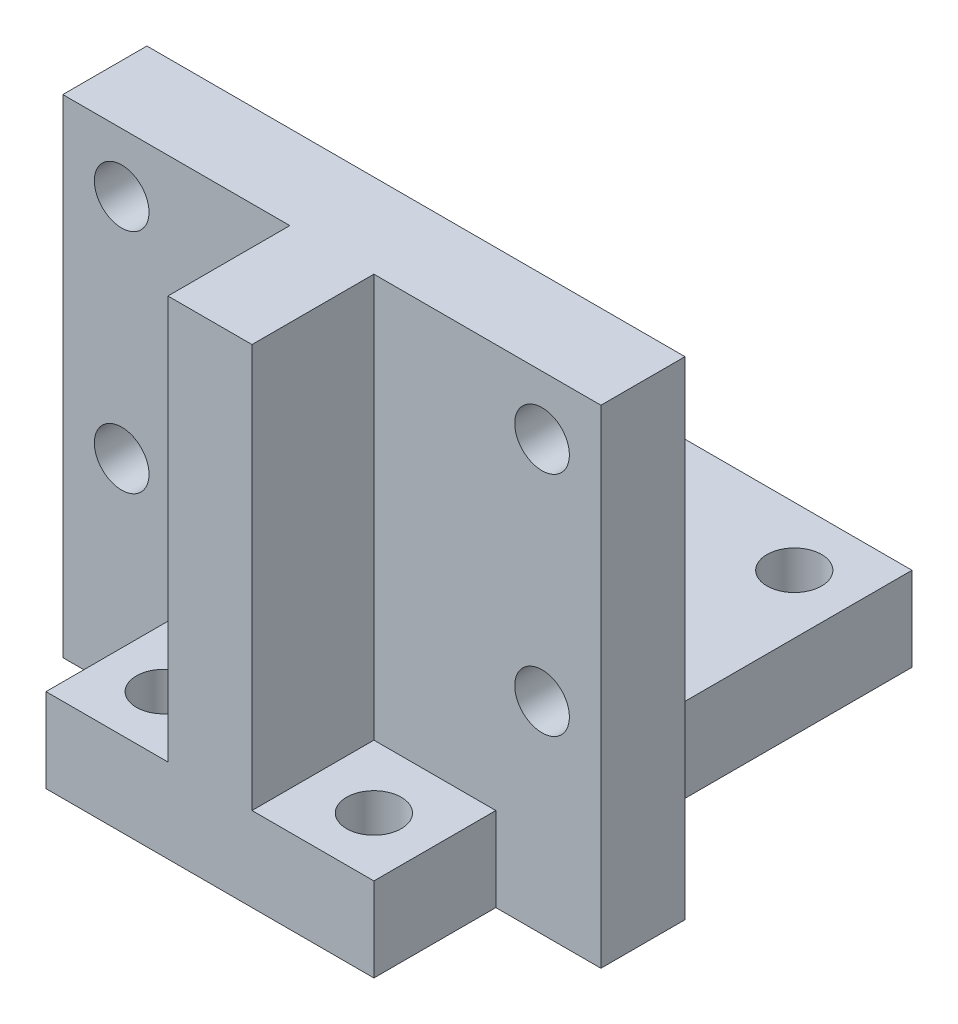
ISO-10303-21;
HEADER;
FILE_DESCRIPTION(('STEP AP214'),'2;1');
FILE_NAME('part.step','',(''),(''),'','','');
FILE_SCHEMA(('AUTOMOTIVE_DESIGN { 1 0 10303 214 1 1 1 1 }'));
ENDSEC;
DATA;
#1=APPLICATION_CONTEXT('core data for automotive mechanical design processes');
#2=APPLICATION_PROTOCOL_DEFINITION('international standard','automotive_design',2000,#1);
#3=PRODUCT_CONTEXT('',#1,'mechanical');
#4=PRODUCT('Part','Part','',(#3));
#5=PRODUCT_RELATED_PRODUCT_CATEGORY('part','',(#4));
#6=PRODUCT_DEFINITION_FORMATION('','',#4);
#7=PRODUCT_DEFINITION_CONTEXT('part definition',#1,'design');
#8=PRODUCT_DEFINITION('design','',#6,#7);
#9=PRODUCT_DEFINITION_SHAPE('','',#8);
#10=(LENGTH_UNIT() NAMED_UNIT(*) SI_UNIT(.MILLI.,.METRE.));
#11=(NAMED_UNIT(*) PLANE_ANGLE_UNIT() SI_UNIT($,.RADIAN.));
#12=(NAMED_UNIT(*) SI_UNIT($,.STERADIAN.) SOLID_ANGLE_UNIT());
#13=UNCERTAINTY_MEASURE_WITH_UNIT(LENGTH_MEASURE(1.E-05),#10,'distance_accuracy_value','');
#14=(GEOMETRIC_REPRESENTATION_CONTEXT(3) GLOBAL_UNCERTAINTY_ASSIGNED_CONTEXT((#13)) GLOBAL_UNIT_ASSIGNED_CONTEXT((#10,
#11,#12)) REPRESENTATION_CONTEXT('',''));
#15=CARTESIAN_POINT('',(0.,0.,0.));
#16=DIRECTION('',(0.,0.,1.));
#17=DIRECTION('',(1.,0.,0.));
#18=AXIS2_PLACEMENT_3D('',#15,#16,#17);
#19=CARTESIAN_POINT('',(0.,10.,0.));
#20=DIRECTION('',(0.,-1.,0.));
#21=DIRECTION('',(0.,0.,-1.));
#22=AXIS2_PLACEMENT_3D('',#19,#20,#21);
#23=PLANE('',#22);
#24=CARTESIAN_POINT('',(32.,10.,-7.));
#25=DIRECTION('',(0.,1.,0.));
#26=DIRECTION('',(0.,0.,1.));
#27=AXIS2_PLACEMENT_3D('',#24,#25,#26);
#28=CIRCLE('',#27,3.25);
#29=CARTESIAN_POINT('',(32.,10.,-3.75));
#30=VERTEX_POINT('',#29);
#31=EDGE_CURVE('E295',#30,#30,#28,.T.);
#32=ORIENTED_EDGE('',*,*,#31,.F.);
#33=EDGE_LOOP('',(#32));
#34=FACE_BOUND('',#33,.T.);
#35=DIRECTION('',(1.,0.,0.));
#36=VECTOR('',#35,1.);
#37=CARTESIAN_POINT('',(0.,10.,-14.5));
#38=LINE('',#37,#36);
#39=CARTESIAN_POINT('',(24.5,10.,-14.5));
#40=VERTEX_POINT('',#39);
#41=CARTESIAN_POINT('',(39.,10.,-14.5));
#42=VERTEX_POINT('',#41);
#43=EDGE_CURVE('E281',#40,#42,#38,.T.);
#44=ORIENTED_EDGE('',*,*,#43,.F.);
#45=DIRECTION('',(0.,0.,1.));
#46=VECTOR('',#45,1.);
#47=CARTESIAN_POINT('',(24.5,10.,-39.002));
#48=LINE('',#47,#46);
#49=CARTESIAN_POINT('',(24.5,10.,0.));
#50=VERTEX_POINT('',#49);
#51=EDGE_CURVE('E56',#40,#50,#48,.T.);
#52=ORIENTED_EDGE('',*,*,#51,.T.);
#53=DIRECTION('',(1.,0.,0.));
#54=VECTOR('',#53,1.);
#55=CARTESIAN_POINT('',(0.,10.,0.));
#56=LINE('',#55,#54);
#57=CARTESIAN_POINT('',(39.,10.,0.));
#58=VERTEX_POINT('',#57);
#59=EDGE_CURVE('E164',#50,#58,#56,.T.);
#60=ORIENTED_EDGE('',*,*,#59,.T.);
#61=DIRECTION('',(0.,0.,-1.));
#62=VECTOR('',#61,1.);
#63=CARTESIAN_POINT('',(39.,10.,0.));
#64=LINE('',#63,#62);
#65=EDGE_CURVE('E314',#58,#42,#64,.T.);
#66=ORIENTED_EDGE('',*,*,#65,.T.);
#67=EDGE_LOOP('',(#44,#52,#60,#66));
#68=FACE_BOUND('',#67,.T.);
#69=ADVANCED_FACE('F41',(#34,#68),#23,.F.);
#70=CARTESIAN_POINT('',(0.,0.,-14.5));
#71=DIRECTION('',(0.,0.,-1.));
#72=DIRECTION('',(-1.,0.,0.));
#73=AXIS2_PLACEMENT_3D('',#70,#71,#72);
#74=PLANE('',#73);
#75=CARTESIAN_POINT('',(44.5,24.,-14.5));
#76=DIRECTION('',(0.,0.,1.));
#77=DIRECTION('',(1.,0.,0.));
#78=AXIS2_PLACEMENT_3D('',#75,#76,#77);
#79=CIRCLE('',#78,3.25);
#80=CARTESIAN_POINT('',(47.75,24.,-14.5));
#81=VERTEX_POINT('',#80);
#82=EDGE_CURVE('E220',#81,#81,#79,.T.);
#83=ORIENTED_EDGE('',*,*,#82,.F.);
#84=EDGE_LOOP('',(#83));
#85=FACE_BOUND('',#84,.T.);
#86=CARTESIAN_POINT('',(44.5,51.,-14.5));
#87=DIRECTION('',(0.,0.,1.));
#88=DIRECTION('',(1.,0.,0.));
#89=AXIS2_PLACEMENT_3D('',#86,#87,#88);
#90=CIRCLE('',#89,3.25);
#91=CARTESIAN_POINT('',(47.75,51.,-14.5));
#92=VERTEX_POINT('',#91);
#93=EDGE_CURVE('E232',#92,#92,#90,.T.);
#94=ORIENTED_EDGE('',*,*,#93,.F.);
#95=EDGE_LOOP('',(#94));
#96=FACE_BOUND('',#95,.T.);
#97=DIRECTION('',(-1.,0.,0.));
#98=VECTOR('',#97,1.);
#99=CARTESIAN_POINT('',(-12.5,58.,-14.5));
#100=LINE('',#99,#98);
#101=CARTESIAN_POINT('',(51.5,58.,-14.5));
#102=VERTEX_POINT('',#101);
#103=CARTESIAN_POINT('',(24.5,58.,-14.5));
#104=VERTEX_POINT('',#103);
#105=EDGE_CURVE('E255',#102,#104,#100,.T.);
#106=ORIENTED_EDGE('',*,*,#105,.T.);
#107=DIRECTION('',(0.,1.,0.));
#108=VECTOR('',#107,1.);
#109=CARTESIAN_POINT('',(24.5,10.,-14.5));
#110=LINE('',#109,#108);
#111=EDGE_CURVE('E213',#40,#104,#110,.T.);
#112=ORIENTED_EDGE('',*,*,#111,.F.);
#113=ORIENTED_EDGE('',*,*,#43,.T.);
#114=DIRECTION('',(0.,-1.,0.));
#115=VECTOR('',#114,1.);
#116=CARTESIAN_POINT('',(39.,10.,-14.5));
#117=LINE('',#116,#115);
#118=CARTESIAN_POINT('',(39.,0.,-14.5));
#119=VERTEX_POINT('',#118);
#120=EDGE_CURVE('E11',#42,#119,#117,.T.);
#121=ORIENTED_EDGE('',*,*,#120,.T.);
#122=DIRECTION('',(1.,0.,0.));
#123=VECTOR('',#122,1.);
#124=CARTESIAN_POINT('',(-12.5,0.,-14.5));
#125=LINE('',#124,#123);
#126=CARTESIAN_POINT('',(51.5,0.,-14.5));
#127=VERTEX_POINT('',#126);
#128=EDGE_CURVE('E247',#119,#127,#125,.T.);
#129=ORIENTED_EDGE('',*,*,#128,.T.);
#130=DIRECTION('',(0.,1.,0.));
#131=VECTOR('',#130,1.);
#132=CARTESIAN_POINT('',(51.5,0.,-14.5));
#133=LINE('',#132,#131);
#134=EDGE_CURVE('E252',#127,#102,#133,.T.);
#135=ORIENTED_EDGE('',*,*,#134,.T.);
#136=EDGE_LOOP('',(#106,#112,#113,#121,#129,#135));
#137=FACE_BOUND('',#136,.T.);
#138=ADVANCED_FACE('F349',(#85,#96,#137),#74,.F.);
#139=CARTESIAN_POINT('',(7.,10.,-7.));
#140=DIRECTION('',(0.,1.,0.));
#141=DIRECTION('',(0.,0.,1.));
#142=AXIS2_PLACEMENT_3D('',#139,#140,#141);
#143=CIRCLE('',#142,3.25);
#144=CARTESIAN_POINT('',(7.,10.,-3.75));
#145=VERTEX_POINT('',#144);
#146=EDGE_CURVE('E289',#145,#145,#143,.T.);
#147=ORIENTED_EDGE('',*,*,#146,.F.);
#148=EDGE_LOOP('',(#147));
#149=FACE_BOUND('',#148,.T.);
#150=CARTESIAN_POINT('',(0.,10.,0.));
#151=VERTEX_POINT('',#150);
#152=CARTESIAN_POINT('',(14.5,10.,0.));
#153=VERTEX_POINT('',#152);
#154=EDGE_CURVE('E64',#151,#153,#56,.T.);
#155=ORIENTED_EDGE('',*,*,#154,.T.);
#156=DIRECTION('',(0.,0.,1.));
#157=VECTOR('',#156,1.);
#158=CARTESIAN_POINT('',(14.5,10.,-39.002));
#159=LINE('',#158,#157);
#160=CARTESIAN_POINT('',(14.5,10.,-14.5));
#161=VERTEX_POINT('',#160);
#162=EDGE_CURVE('E211',#161,#153,#159,.T.);
#163=ORIENTED_EDGE('',*,*,#162,.F.);
#164=CARTESIAN_POINT('',(0.,10.,-14.5));
#165=VERTEX_POINT('',#164);
#166=EDGE_CURVE('E282',#165,#161,#38,.T.);
#167=ORIENTED_EDGE('',*,*,#166,.F.);
#168=DIRECTION('',(0.,0.,1.));
#169=VECTOR('',#168,1.);
#170=CARTESIAN_POINT('',(0.,10.,0.));
#171=LINE('',#170,#169);
#172=EDGE_CURVE('E165',#165,#151,#171,.T.);
#173=ORIENTED_EDGE('',*,*,#172,.T.);
#174=EDGE_LOOP('',(#155,#163,#167,#173));
#175=FACE_BOUND('',#174,.T.);
#176=ADVANCED_FACE('F383',(#149,#175),#23,.F.);
#177=CARTESIAN_POINT('',(0.,10.,0.));
#178=DIRECTION('',(1.,0.,0.));
#179=DIRECTION('',(0.,0.,-1.));
#180=AXIS2_PLACEMENT_3D('',#177,#178,#179);
#181=PLANE('',#180);
#182=DIRECTION('',(0.,1.,0.));
#183=VECTOR('',#182,1.);
#184=CARTESIAN_POINT('',(0.,10.,-14.5));
#185=LINE('',#184,#183);
#186=CARTESIAN_POINT('',(0.,0.,-14.5));
#187=VERTEX_POINT('',#186);
#188=EDGE_CURVE('E285',#187,#165,#185,.T.);
#189=ORIENTED_EDGE('',*,*,#188,.F.);
#190=DIRECTION('',(0.,0.,1.));
#191=VECTOR('',#190,1.);
#192=CARTESIAN_POINT('',(0.,0.,0.));
#193=LINE('',#192,#191);
#194=CARTESIAN_POINT('',(0.,0.,0.));
#195=VERTEX_POINT('',#194);
#196=EDGE_CURVE('E310',#187,#195,#193,.T.);
#197=ORIENTED_EDGE('',*,*,#196,.T.);
#198=DIRECTION('',(0.,-1.,0.));
#199=VECTOR('',#198,1.);
#200=CARTESIAN_POINT('',(0.,10.,0.));
#201=LINE('',#200,#199);
#202=EDGE_CURVE('E327',#151,#195,#201,.T.);
#203=ORIENTED_EDGE('',*,*,#202,.F.);
#204=ORIENTED_EDGE('',*,*,#172,.F.);
#205=EDGE_LOOP('',(#189,#197,#203,#204));
#206=FACE_BOUND('',#205,.T.);
#207=ADVANCED_FACE('F364',(#206),#181,.F.);
#208=CARTESIAN_POINT('',(39.,10.,0.));
#209=DIRECTION('',(-1.,0.,0.));
#210=DIRECTION('',(0.,0.,1.));
#211=AXIS2_PLACEMENT_3D('',#208,#209,#210);
#212=PLANE('',#211);
#213=ORIENTED_EDGE('',*,*,#120,.F.);
#214=ORIENTED_EDGE('',*,*,#65,.F.);
#215=DIRECTION('',(0.,-1.,0.));
#216=VECTOR('',#215,1.);
#217=CARTESIAN_POINT('',(39.,10.,0.));
#218=LINE('',#217,#216);
#219=CARTESIAN_POINT('',(39.,0.,0.));
#220=VERTEX_POINT('',#219);
#221=EDGE_CURVE('E317',#58,#220,#218,.T.);
#222=ORIENTED_EDGE('',*,*,#221,.T.);
#223=DIRECTION('',(0.,0.,-1.));
#224=VECTOR('',#223,1.);
#225=CARTESIAN_POINT('',(39.,0.,0.));
#226=LINE('',#225,#224);
#227=EDGE_CURVE('E323',#220,#119,#226,.T.);
#228=ORIENTED_EDGE('',*,*,#227,.T.);
#229=EDGE_LOOP('',(#213,#214,#222,#228));
#230=FACE_BOUND('',#229,.T.);
#231=ADVANCED_FACE('F355',(#230),#212,.F.);
#232=CARTESIAN_POINT('',(0.,10.,-64.));
#233=VERTEX_POINT('',#232);
#234=CARTESIAN_POINT('',(0.,10.,-24.5));
#235=VERTEX_POINT('',#234);
#236=EDGE_CURVE('E155',#233,#235,#171,.T.);
#237=ORIENTED_EDGE('',*,*,#236,.T.);
#238=DIRECTION('',(1.,0.,0.));
#239=VECTOR('',#238,1.);
#240=CARTESIAN_POINT('',(0.,10.,-24.5));
#241=LINE('',#240,#239);
#242=CARTESIAN_POINT('',(39.,10.,-24.5));
#243=VERTEX_POINT('',#242);
#244=EDGE_CURVE('E278',#235,#243,#241,.T.);
#245=ORIENTED_EDGE('',*,*,#244,.T.);
#246=CARTESIAN_POINT('',(39.,10.,-64.));
#247=VERTEX_POINT('',#246);
#248=EDGE_CURVE('E179',#243,#247,#64,.T.);
#249=ORIENTED_EDGE('',*,*,#248,.T.);
#250=DIRECTION('',(-1.,0.,0.));
#251=VECTOR('',#250,1.);
#252=CARTESIAN_POINT('',(0.,10.,-64.));
#253=LINE('',#252,#251);
#254=EDGE_CURVE('E171',#247,#233,#253,.T.);
#255=ORIENTED_EDGE('',*,*,#254,.T.);
#256=EDGE_LOOP('',(#237,#245,#249,#255));
#257=FACE_BOUND('',#256,.T.);
#258=CARTESIAN_POINT('',(7.,10.,-32.));
#259=DIRECTION('',(0.,1.,0.));
#260=DIRECTION('',(0.,0.,1.));
#261=AXIS2_PLACEMENT_3D('',#258,#259,#260);
#262=CIRCLE('',#261,3.25);
#263=CARTESIAN_POINT('',(7.,10.,-28.75));
#264=VERTEX_POINT('',#263);
#265=EDGE_CURVE('E307',#264,#264,#262,.T.);
#266=ORIENTED_EDGE('',*,*,#265,.F.);
#267=EDGE_LOOP('',(#266));
#268=FACE_BOUND('',#267,.T.);
#269=CARTESIAN_POINT('',(32.,10.,-32.));
#270=DIRECTION('',(0.,1.,0.));
#271=DIRECTION('',(0.,0.,1.));
#272=AXIS2_PLACEMENT_3D('',#269,#270,#271);
#273=CIRCLE('',#272,3.25);
#274=CARTESIAN_POINT('',(32.,10.,-28.75));
#275=VERTEX_POINT('',#274);
#276=EDGE_CURVE('E301',#275,#275,#273,.T.);
#277=ORIENTED_EDGE('',*,*,#276,.F.);
#278=EDGE_LOOP('',(#277));
#279=FACE_BOUND('',#278,.T.);
#280=CARTESIAN_POINT('',(32.,10.,-57.));
#281=DIRECTION('',(0.,1.,0.));
#282=DIRECTION('',(0.,0.,1.));
#283=AXIS2_PLACEMENT_3D('',#280,#281,#282);
#284=CIRCLE('',#283,3.25);
#285=CARTESIAN_POINT('',(32.,9.99999999999999,-53.75));
#286=VERTEX_POINT('',#285);
#287=EDGE_CURVE('E182',#286,#286,#284,.T.);
#288=ORIENTED_EDGE('',*,*,#287,.F.);
#289=EDGE_LOOP('',(#288));
#290=FACE_BOUND('',#289,.T.);
#291=CARTESIAN_POINT('',(7.,10.,-57.));
#292=DIRECTION('',(0.,1.,0.));
#293=DIRECTION('',(0.,0.,1.));
#294=AXIS2_PLACEMENT_3D('',#291,#292,#293);
#295=CIRCLE('',#294,3.25);
#296=CARTESIAN_POINT('',(7.,9.99999999999999,-53.75));
#297=VERTEX_POINT('',#296);
#298=EDGE_CURVE('E188',#297,#297,#295,.T.);
#299=ORIENTED_EDGE('',*,*,#298,.F.);
#300=EDGE_LOOP('',(#299));
#301=FACE_BOUND('',#300,.T.);
#302=ADVANCED_FACE('F176',(#257,#268,#279,#290,#301),#23,.F.);
#303=CARTESIAN_POINT('',(0.,0.,0.));
#304=DIRECTION('',(0.,-1.,0.));
#305=DIRECTION('',(0.,0.,-1.));
#306=AXIS2_PLACEMENT_3D('',#303,#304,#305);
#307=PLANE('',#306);
#308=CARTESIAN_POINT('',(39.,0.,-24.5));
#309=VERTEX_POINT('',#308);
#310=CARTESIAN_POINT('',(39.,0.,-64.));
#311=VERTEX_POINT('',#310);
#312=EDGE_CURVE('E322',#309,#311,#226,.T.);
#313=ORIENTED_EDGE('',*,*,#312,.F.);
#314=DIRECTION('',(1.,0.,0.));
#315=VECTOR('',#314,1.);
#316=CARTESIAN_POINT('',(-12.5,0.,-24.5));
#317=LINE('',#316,#315);
#318=CARTESIAN_POINT('',(51.5,0.,-24.5));
#319=VERTEX_POINT('',#318);
#320=EDGE_CURVE('E260',#309,#319,#317,.T.);
#321=ORIENTED_EDGE('',*,*,#320,.T.);
#322=DIRECTION('',(0.,0.,-1.));
#323=VECTOR('',#322,1.);
#324=CARTESIAN_POINT('',(51.5,0.,-14.5));
#325=LINE('',#324,#323);
#326=EDGE_CURVE('E272',#127,#319,#325,.T.);
#327=ORIENTED_EDGE('',*,*,#326,.F.);
#328=ORIENTED_EDGE('',*,*,#128,.F.);
#329=ORIENTED_EDGE('',*,*,#227,.F.);
#330=DIRECTION('',(1.,0.,0.));
#331=VECTOR('',#330,1.);
#332=CARTESIAN_POINT('',(0.,0.,0.));
#333=LINE('',#332,#331);
#334=EDGE_CURVE('E320',#195,#220,#333,.T.);
#335=ORIENTED_EDGE('',*,*,#334,.F.);
#336=ORIENTED_EDGE('',*,*,#196,.F.);
#337=CARTESIAN_POINT('',(-12.5,0.,-14.5));
#338=VERTEX_POINT('',#337);
#339=EDGE_CURVE('E249',#338,#187,#125,.T.);
#340=ORIENTED_EDGE('',*,*,#339,.F.);
#341=DIRECTION('',(0.,0.,-1.));
#342=VECTOR('',#341,1.);
#343=CARTESIAN_POINT('',(-12.5,0.,-14.5));
#344=LINE('',#343,#342);
#345=CARTESIAN_POINT('',(-12.5,0.,-24.5));
#346=VERTEX_POINT('',#345);
#347=EDGE_CURVE('E275',#338,#346,#344,.T.);
#348=ORIENTED_EDGE('',*,*,#347,.T.);
#349=CARTESIAN_POINT('',(0.,0.,-24.5));
#350=VERTEX_POINT('',#349);
#351=EDGE_CURVE('E261',#346,#350,#317,.T.);
#352=ORIENTED_EDGE('',*,*,#351,.T.);
#353=CARTESIAN_POINT('',(0.,0.,-64.));
#354=VERTEX_POINT('',#353);
#355=EDGE_CURVE('E318',#354,#350,#193,.T.);
#356=ORIENTED_EDGE('',*,*,#355,.F.);
#357=DIRECTION('',(-1.,0.,0.));
#358=VECTOR('',#357,1.);
#359=CARTESIAN_POINT('',(0.,0.,-64.));
#360=LINE('',#359,#358);
#361=EDGE_CURVE('E173',#311,#354,#360,.T.);
#362=ORIENTED_EDGE('',*,*,#361,.F.);
#363=EDGE_LOOP('',(#313,#321,#327,#328,#329,#335,#336,#340,#348,#352,#356,#362));
#364=FACE_BOUND('',#363,.T.);
#365=CARTESIAN_POINT('',(7.,0.,-32.));
#366=DIRECTION('',(0.,1.,0.));
#367=DIRECTION('',(0.,0.,1.));
#368=AXIS2_PLACEMENT_3D('',#365,#366,#367);
#369=CIRCLE('',#368,3.25);
#370=CARTESIAN_POINT('',(7.,0.,-28.75));
#371=VERTEX_POINT('',#370);
#372=EDGE_CURVE('E304',#371,#371,#369,.T.);
#373=ORIENTED_EDGE('',*,*,#372,.T.);
#374=EDGE_LOOP('',(#373));
#375=FACE_BOUND('',#374,.T.);
#376=CARTESIAN_POINT('',(32.,0.,-32.));
#377=DIRECTION('',(0.,1.,0.));
#378=DIRECTION('',(0.,0.,1.));
#379=AXIS2_PLACEMENT_3D('',#376,#377,#378);
#380=CIRCLE('',#379,3.25);
#381=CARTESIAN_POINT('',(32.,0.,-28.75));
#382=VERTEX_POINT('',#381);
#383=EDGE_CURVE('E298',#382,#382,#380,.T.);
#384=ORIENTED_EDGE('',*,*,#383,.T.);
#385=EDGE_LOOP('',(#384));
#386=FACE_BOUND('',#385,.T.);
#387=CARTESIAN_POINT('',(7.,0.,-7.));
#388=DIRECTION('',(0.,1.,0.));
#389=DIRECTION('',(0.,0.,1.));
#390=AXIS2_PLACEMENT_3D('',#387,#388,#389);
#391=CIRCLE('',#390,3.25);
#392=CARTESIAN_POINT('',(7.,0.,-3.75));
#393=VERTEX_POINT('',#392);
#394=EDGE_CURVE('E288',#393,#393,#391,.T.);
#395=ORIENTED_EDGE('',*,*,#394,.T.);
#396=EDGE_LOOP('',(#395));
#397=FACE_BOUND('',#396,.T.);
#398=CARTESIAN_POINT('',(32.,0.,-7.));
#399=DIRECTION('',(0.,1.,0.));
#400=DIRECTION('',(0.,0.,1.));
#401=AXIS2_PLACEMENT_3D('',#398,#399,#400);
#402=CIRCLE('',#401,3.25);
#403=CARTESIAN_POINT('',(32.,0.,-3.75));
#404=VERTEX_POINT('',#403);
#405=EDGE_CURVE('E292',#404,#404,#402,.T.);
#406=ORIENTED_EDGE('',*,*,#405,.T.);
#407=EDGE_LOOP('',(#406));
#408=FACE_BOUND('',#407,.T.);
#409=CARTESIAN_POINT('',(32.,0.,-57.));
#410=DIRECTION('',(0.,-1.,0.));
#411=DIRECTION('',(0.,0.,-1.));
#412=AXIS2_PLACEMENT_3D('',#409,#410,#411);
#413=CIRCLE('',#412,3.25);
#414=CARTESIAN_POINT('',(32.,0.,-53.75));
#415=VERTEX_POINT('',#414);
#416=EDGE_CURVE('E181',#415,#415,#413,.F.);
#417=ORIENTED_EDGE('',*,*,#416,.T.);
#418=EDGE_LOOP('',(#417));
#419=FACE_BOUND('',#418,.T.);
#420=CARTESIAN_POINT('',(7.,0.,-57.));
#421=DIRECTION('',(0.,-1.,0.));
#422=DIRECTION('',(0.,0.,-1.));
#423=AXIS2_PLACEMENT_3D('',#420,#421,#422);
#424=CIRCLE('',#423,3.25);
#425=CARTESIAN_POINT('',(7.,0.,-53.75));
#426=VERTEX_POINT('',#425);
#427=EDGE_CURVE('E185',#426,#426,#424,.F.);
#428=ORIENTED_EDGE('',*,*,#427,.T.);
#429=EDGE_LOOP('',(#428));
#430=FACE_BOUND('',#429,.T.);
#431=ADVANCED_FACE('F340',(#364,#375,#386,#397,#408,#419,#430),#307,.T.);
#432=ORIENTED_EDGE('',*,*,#355,.T.);
#433=DIRECTION('',(0.,1.,0.));
#434=VECTOR('',#433,1.);
#435=CARTESIAN_POINT('',(0.,10.,-24.5));
#436=LINE('',#435,#434);
#437=EDGE_CURVE('E160',#350,#235,#436,.T.);
#438=ORIENTED_EDGE('',*,*,#437,.T.);
#439=ORIENTED_EDGE('',*,*,#236,.F.);
#440=DIRECTION('',(0.,1.,0.));
#441=VECTOR('',#440,1.);
#442=CARTESIAN_POINT('',(0.,-46.3249392876019,-64.));
#443=LINE('',#442,#441);
#444=EDGE_CURVE('E157',#354,#233,#443,.T.);
#445=ORIENTED_EDGE('',*,*,#444,.F.);
#446=EDGE_LOOP('',(#432,#438,#439,#445));
#447=FACE_BOUND('',#446,.T.);
#448=ADVANCED_FACE('F43',(#447),#181,.F.);
#449=CARTESIAN_POINT('',(0.,10.,0.));
#450=DIRECTION('',(0.,0.,-1.));
#451=DIRECTION('',(-1.,0.,0.));
#452=AXIS2_PLACEMENT_3D('',#449,#450,#451);
#453=PLANE('',#452);
#454=ORIENTED_EDGE('',*,*,#334,.T.);
#455=ORIENTED_EDGE('',*,*,#221,.F.);
#456=ORIENTED_EDGE('',*,*,#59,.F.);
#457=DIRECTION('',(0.,1.,0.));
#458=VECTOR('',#457,1.);
#459=CARTESIAN_POINT('',(24.5,10.,0.));
#460=LINE('',#459,#458);
#461=CARTESIAN_POINT('',(24.5,58.,0.));
#462=VERTEX_POINT('',#461);
#463=EDGE_CURVE('E198',#50,#462,#460,.T.);
#464=ORIENTED_EDGE('',*,*,#463,.T.);
#465=DIRECTION('',(-1.,0.,0.));
#466=VECTOR('',#465,1.);
#467=CARTESIAN_POINT('',(14.5,58.,0.));
#468=LINE('',#467,#466);
#469=CARTESIAN_POINT('',(14.5,58.,0.));
#470=VERTEX_POINT('',#469);
#471=EDGE_CURVE('E202',#462,#470,#468,.T.);
#472=ORIENTED_EDGE('',*,*,#471,.T.);
#473=DIRECTION('',(0.,-1.,0.));
#474=VECTOR('',#473,1.);
#475=CARTESIAN_POINT('',(14.5,10.,0.));
#476=LINE('',#475,#474);
#477=EDGE_CURVE('E194',#470,#153,#476,.T.);
#478=ORIENTED_EDGE('',*,*,#477,.T.);
#479=ORIENTED_EDGE('',*,*,#154,.F.);
#480=ORIENTED_EDGE('',*,*,#202,.T.);
#481=EDGE_LOOP('',(#454,#455,#456,#464,#472,#478,#479,#480));
#482=FACE_BOUND('',#481,.T.);
#483=ADVANCED_FACE('F359',(#482),#453,.F.);
#484=ORIENTED_EDGE('',*,*,#248,.F.);
#485=DIRECTION('',(0.,-1.,0.));
#486=VECTOR('',#485,1.);
#487=CARTESIAN_POINT('',(39.,10.,-24.5));
#488=LINE('',#487,#486);
#489=EDGE_CURVE('E49',#243,#309,#488,.T.);
#490=ORIENTED_EDGE('',*,*,#489,.T.);
#491=ORIENTED_EDGE('',*,*,#312,.T.);
#492=DIRECTION('',(0.,1.,0.));
#493=VECTOR('',#492,1.);
#494=CARTESIAN_POINT('',(39.,-46.3249392876019,-64.));
#495=LINE('',#494,#493);
#496=EDGE_CURVE('E174',#311,#247,#495,.T.);
#497=ORIENTED_EDGE('',*,*,#496,.T.);
#498=EDGE_LOOP('',(#484,#490,#491,#497));
#499=FACE_BOUND('',#498,.T.);
#500=ADVANCED_FACE('F333',(#499),#212,.F.);
#501=CARTESIAN_POINT('',(7.,10.,-32.));
#502=DIRECTION('',(0.,-1.,0.));
#503=DIRECTION('',(0.,0.,-1.));
#504=AXIS2_PLACEMENT_3D('',#501,#502,#503);
#505=CYLINDRICAL_SURFACE('',#504,3.25);
#506=ORIENTED_EDGE('',*,*,#265,.T.);
#507=EDGE_LOOP('',(#506));
#508=FACE_BOUND('',#507,.T.);
#509=ORIENTED_EDGE('',*,*,#372,.F.);
#510=EDGE_LOOP('',(#509));
#511=FACE_BOUND('',#510,.T.);
#512=ADVANCED_FACE('F407',(#508,#511),#505,.F.);
#513=CARTESIAN_POINT('',(32.,10.,-32.));
#514=DIRECTION('',(0.,-1.,0.));
#515=DIRECTION('',(0.,0.,-1.));
#516=AXIS2_PLACEMENT_3D('',#513,#514,#515);
#517=CYLINDRICAL_SURFACE('',#516,3.25);
#518=ORIENTED_EDGE('',*,*,#276,.T.);
#519=EDGE_LOOP('',(#518));
#520=FACE_BOUND('',#519,.T.);
#521=ORIENTED_EDGE('',*,*,#383,.F.);
#522=EDGE_LOOP('',(#521));
#523=FACE_BOUND('',#522,.T.);
#524=ADVANCED_FACE('F413',(#520,#523),#517,.F.);
#525=CARTESIAN_POINT('',(32.,10.,-7.));
#526=DIRECTION('',(0.,-1.,0.));
#527=DIRECTION('',(0.,0.,-1.));
#528=AXIS2_PLACEMENT_3D('',#525,#526,#527);
#529=CYLINDRICAL_SURFACE('',#528,3.25);
#530=ORIENTED_EDGE('',*,*,#31,.T.);
#531=EDGE_LOOP('',(#530));
#532=FACE_BOUND('',#531,.T.);
#533=ORIENTED_EDGE('',*,*,#405,.F.);
#534=EDGE_LOOP('',(#533));
#535=FACE_BOUND('',#534,.T.);
#536=ADVANCED_FACE('F570',(#532,#535),#529,.F.);
#537=CARTESIAN_POINT('',(7.,10.,-7.));
#538=DIRECTION('',(0.,-1.,0.));
#539=DIRECTION('',(0.,0.,-1.));
#540=AXIS2_PLACEMENT_3D('',#537,#538,#539);
#541=CYLINDRICAL_SURFACE('',#540,3.25);
#542=ORIENTED_EDGE('',*,*,#146,.T.);
#543=EDGE_LOOP('',(#542));
#544=FACE_BOUND('',#543,.T.);
#545=ORIENTED_EDGE('',*,*,#394,.F.);
#546=EDGE_LOOP('',(#545));
#547=FACE_BOUND('',#546,.T.);
#548=ADVANCED_FACE('F548',(#544,#547),#541,.F.);
#549=CARTESIAN_POINT('',(-5.5,51.,-14.5));
#550=DIRECTION('',(0.,0.,1.));
#551=DIRECTION('',(1.,0.,0.));
#552=AXIS2_PLACEMENT_3D('',#549,#550,#551);
#553=CIRCLE('',#552,3.25);
#554=CARTESIAN_POINT('',(-2.25,51.,-14.5));
#555=VERTEX_POINT('',#554);
#556=EDGE_CURVE('E238',#555,#555,#553,.T.);
#557=ORIENTED_EDGE('',*,*,#556,.F.);
#558=EDGE_LOOP('',(#557));
#559=FACE_BOUND('',#558,.T.);
#560=CARTESIAN_POINT('',(-5.5,24.,-14.5));
#561=DIRECTION('',(0.,0.,1.));
#562=DIRECTION('',(1.,0.,0.));
#563=AXIS2_PLACEMENT_3D('',#560,#561,#562);
#564=CIRCLE('',#563,3.25);
#565=CARTESIAN_POINT('',(-2.25,24.,-14.5));
#566=VERTEX_POINT('',#565);
#567=EDGE_CURVE('E226',#566,#566,#564,.T.);
#568=ORIENTED_EDGE('',*,*,#567,.F.);
#569=EDGE_LOOP('',(#568));
#570=FACE_BOUND('',#569,.T.);
#571=ORIENTED_EDGE('',*,*,#166,.T.);
#572=DIRECTION('',(0.,-1.,0.));
#573=VECTOR('',#572,1.);
#574=CARTESIAN_POINT('',(14.5,10.,-14.5));
#575=LINE('',#574,#573);
#576=CARTESIAN_POINT('',(14.5,58.,-14.5));
#577=VERTEX_POINT('',#576);
#578=EDGE_CURVE('E216',#577,#161,#575,.T.);
#579=ORIENTED_EDGE('',*,*,#578,.F.);
#580=CARTESIAN_POINT('',(-12.5,58.,-14.5));
#581=VERTEX_POINT('',#580);
#582=EDGE_CURVE('E254',#577,#581,#100,.T.);
#583=ORIENTED_EDGE('',*,*,#582,.T.);
#584=DIRECTION('',(0.,-1.,0.));
#585=VECTOR('',#584,1.);
#586=CARTESIAN_POINT('',(-12.5,0.,-14.5));
#587=LINE('',#586,#585);
#588=EDGE_CURVE('E244',#581,#338,#587,.T.);
#589=ORIENTED_EDGE('',*,*,#588,.T.);
#590=ORIENTED_EDGE('',*,*,#339,.T.);
#591=ORIENTED_EDGE('',*,*,#188,.T.);
#592=EDGE_LOOP('',(#571,#579,#583,#589,#590,#591));
#593=FACE_BOUND('',#592,.T.);
#594=ADVANCED_FACE('F366',(#559,#570,#593),#74,.F.);
#595=CARTESIAN_POINT('',(0.,0.,-24.5));
#596=DIRECTION('',(0.,0.,-1.));
#597=DIRECTION('',(-1.,0.,0.));
#598=AXIS2_PLACEMENT_3D('',#595,#596,#597);
#599=PLANE('',#598);
#600=CARTESIAN_POINT('',(44.5,24.,-24.5));
#601=DIRECTION('',(0.,0.,1.));
#602=DIRECTION('',(1.,0.,0.));
#603=AXIS2_PLACEMENT_3D('',#600,#601,#602);
#604=CIRCLE('',#603,3.25);
#605=CARTESIAN_POINT('',(47.75,24.,-24.5));
#606=VERTEX_POINT('',#605);
#607=EDGE_CURVE('E219',#606,#606,#604,.T.);
#608=ORIENTED_EDGE('',*,*,#607,.T.);
#609=EDGE_LOOP('',(#608));
#610=FACE_BOUND('',#609,.T.);
#611=CARTESIAN_POINT('',(44.5,51.,-24.5));
#612=DIRECTION('',(0.,0.,1.));
#613=DIRECTION('',(1.,0.,0.));
#614=AXIS2_PLACEMENT_3D('',#611,#612,#613);
#615=CIRCLE('',#614,3.25);
#616=CARTESIAN_POINT('',(47.75,51.,-24.5));
#617=VERTEX_POINT('',#616);
#618=EDGE_CURVE('E229',#617,#617,#615,.T.);
#619=ORIENTED_EDGE('',*,*,#618,.T.);
#620=EDGE_LOOP('',(#619));
#621=FACE_BOUND('',#620,.T.);
#622=CARTESIAN_POINT('',(-5.5,51.,-24.5));
#623=DIRECTION('',(0.,0.,1.));
#624=DIRECTION('',(1.,0.,0.));
#625=AXIS2_PLACEMENT_3D('',#622,#623,#624);
#626=CIRCLE('',#625,3.25);
#627=CARTESIAN_POINT('',(-2.25,51.,-24.5));
#628=VERTEX_POINT('',#627);
#629=EDGE_CURVE('E235',#628,#628,#626,.T.);
#630=ORIENTED_EDGE('',*,*,#629,.T.);
#631=EDGE_LOOP('',(#630));
#632=FACE_BOUND('',#631,.T.);
#633=CARTESIAN_POINT('',(-5.5,24.,-24.5));
#634=DIRECTION('',(0.,0.,1.));
#635=DIRECTION('',(1.,0.,0.));
#636=AXIS2_PLACEMENT_3D('',#633,#634,#635);
#637=CIRCLE('',#636,3.25);
#638=CARTESIAN_POINT('',(-2.25,24.,-24.5));
#639=VERTEX_POINT('',#638);
#640=EDGE_CURVE('E223',#639,#639,#637,.T.);
#641=ORIENTED_EDGE('',*,*,#640,.T.);
#642=EDGE_LOOP('',(#641));
#643=FACE_BOUND('',#642,.T.);
#644=ORIENTED_EDGE('',*,*,#437,.F.);
#645=ORIENTED_EDGE('',*,*,#351,.F.);
#646=DIRECTION('',(0.,-1.,0.));
#647=VECTOR('',#646,1.);
#648=CARTESIAN_POINT('',(-12.5,0.,-24.5));
#649=LINE('',#648,#647);
#650=CARTESIAN_POINT('',(-12.5,58.,-24.5));
#651=VERTEX_POINT('',#650);
#652=EDGE_CURVE('E241',#651,#346,#649,.T.);
#653=ORIENTED_EDGE('',*,*,#652,.F.);
#654=DIRECTION('',(-1.,0.,0.));
#655=VECTOR('',#654,1.);
#656=CARTESIAN_POINT('',(-12.5,58.,-24.5));
#657=LINE('',#656,#655);
#658=CARTESIAN_POINT('',(51.5,58.,-24.5));
#659=VERTEX_POINT('',#658);
#660=EDGE_CURVE('E248',#659,#651,#657,.T.);
#661=ORIENTED_EDGE('',*,*,#660,.F.);
#662=DIRECTION('',(0.,1.,0.));
#663=VECTOR('',#662,1.);
#664=CARTESIAN_POINT('',(51.5,0.,-24.5));
#665=LINE('',#664,#663);
#666=EDGE_CURVE('E264',#319,#659,#665,.T.);
#667=ORIENTED_EDGE('',*,*,#666,.F.);
#668=ORIENTED_EDGE('',*,*,#320,.F.);
#669=ORIENTED_EDGE('',*,*,#489,.F.);
#670=ORIENTED_EDGE('',*,*,#244,.F.);
#671=EDGE_LOOP('',(#644,#645,#653,#661,#667,#668,#669,#670));
#672=FACE_BOUND('',#671,.T.);
#673=ADVANCED_FACE('F336',(#610,#621,#632,#643,#672),#599,.T.);
#674=CARTESIAN_POINT('',(-12.5,0.,-14.5));
#675=DIRECTION('',(1.,0.,0.));
#676=DIRECTION('',(0.,1.,0.));
#677=AXIS2_PLACEMENT_3D('',#674,#675,#676);
#678=PLANE('',#677);
#679=ORIENTED_EDGE('',*,*,#652,.T.);
#680=ORIENTED_EDGE('',*,*,#347,.F.);
#681=ORIENTED_EDGE('',*,*,#588,.F.);
#682=DIRECTION('',(0.,0.,-1.));
#683=VECTOR('',#682,1.);
#684=CARTESIAN_POINT('',(-12.5,58.,-14.5));
#685=LINE('',#684,#683);
#686=EDGE_CURVE('E257',#581,#651,#685,.T.);
#687=ORIENTED_EDGE('',*,*,#686,.T.);
#688=EDGE_LOOP('',(#679,#680,#681,#687));
#689=FACE_BOUND('',#688,.T.);
#690=ADVANCED_FACE('F372',(#689),#678,.F.);
#691=CARTESIAN_POINT('',(51.5,0.,-14.5));
#692=DIRECTION('',(-1.,0.,0.));
#693=DIRECTION('',(0.,0.,1.));
#694=AXIS2_PLACEMENT_3D('',#691,#692,#693);
#695=PLANE('',#694);
#696=ORIENTED_EDGE('',*,*,#666,.T.);
#697=DIRECTION('',(0.,0.,-1.));
#698=VECTOR('',#697,1.);
#699=CARTESIAN_POINT('',(51.5,58.,-14.5));
#700=LINE('',#699,#698);
#701=EDGE_CURVE('E269',#102,#659,#700,.T.);
#702=ORIENTED_EDGE('',*,*,#701,.F.);
#703=ORIENTED_EDGE('',*,*,#134,.F.);
#704=ORIENTED_EDGE('',*,*,#326,.T.);
#705=EDGE_LOOP('',(#696,#702,#703,#704));
#706=FACE_BOUND('',#705,.T.);
#707=ADVANCED_FACE('F345',(#706),#695,.F.);
#708=CARTESIAN_POINT('',(-12.5,58.,-14.5));
#709=DIRECTION('',(0.,-1.,0.));
#710=DIRECTION('',(0.,0.,-1.));
#711=AXIS2_PLACEMENT_3D('',#708,#709,#710);
#712=PLANE('',#711);
#713=ORIENTED_EDGE('',*,*,#660,.T.);
#714=ORIENTED_EDGE('',*,*,#686,.F.);
#715=ORIENTED_EDGE('',*,*,#582,.F.);
#716=DIRECTION('',(0.,0.,1.));
#717=VECTOR('',#716,1.);
#718=CARTESIAN_POINT('',(14.5,58.,-39.002));
#719=LINE('',#718,#717);
#720=EDGE_CURVE('E201',#577,#470,#719,.T.);
#721=ORIENTED_EDGE('',*,*,#720,.T.);
#722=ORIENTED_EDGE('',*,*,#471,.F.);
#723=DIRECTION('',(0.,0.,1.));
#724=VECTOR('',#723,1.);
#725=CARTESIAN_POINT('',(24.5,58.,-39.002));
#726=LINE('',#725,#724);
#727=EDGE_CURVE('E208',#104,#462,#726,.T.);
#728=ORIENTED_EDGE('',*,*,#727,.F.);
#729=ORIENTED_EDGE('',*,*,#105,.F.);
#730=ORIENTED_EDGE('',*,*,#701,.T.);
#731=EDGE_LOOP('',(#713,#714,#715,#721,#722,#728,#729,#730));
#732=FACE_BOUND('',#731,.T.);
#733=ADVANCED_FACE('F375',(#732),#712,.F.);
#734=CARTESIAN_POINT('',(-5.5,51.,-14.5));
#735=DIRECTION('',(0.,0.,-1.));
#736=DIRECTION('',(-1.,0.,0.));
#737=AXIS2_PLACEMENT_3D('',#734,#735,#736);
#738=CYLINDRICAL_SURFACE('',#737,3.25);
#739=ORIENTED_EDGE('',*,*,#556,.T.);
#740=EDGE_LOOP('',(#739));
#741=FACE_BOUND('',#740,.T.);
#742=ORIENTED_EDGE('',*,*,#629,.F.);
#743=EDGE_LOOP('',(#742));
#744=FACE_BOUND('',#743,.T.);
#745=ADVANCED_FACE('F464',(#741,#744),#738,.F.);
#746=CARTESIAN_POINT('',(44.5,51.,-14.5));
#747=DIRECTION('',(0.,0.,-1.));
#748=DIRECTION('',(-1.,0.,0.));
#749=AXIS2_PLACEMENT_3D('',#746,#747,#748);
#750=CYLINDRICAL_SURFACE('',#749,3.25);
#751=ORIENTED_EDGE('',*,*,#93,.T.);
#752=EDGE_LOOP('',(#751));
#753=FACE_BOUND('',#752,.T.);
#754=ORIENTED_EDGE('',*,*,#618,.F.);
#755=EDGE_LOOP('',(#754));
#756=FACE_BOUND('',#755,.T.);
#757=ADVANCED_FACE('F503',(#753,#756),#750,.F.);
#758=CARTESIAN_POINT('',(-5.5,24.,-14.5));
#759=DIRECTION('',(0.,0.,-1.));
#760=DIRECTION('',(-1.,0.,0.));
#761=AXIS2_PLACEMENT_3D('',#758,#759,#760);
#762=CYLINDRICAL_SURFACE('',#761,3.25);
#763=ORIENTED_EDGE('',*,*,#567,.T.);
#764=EDGE_LOOP('',(#763));
#765=FACE_BOUND('',#764,.T.);
#766=ORIENTED_EDGE('',*,*,#640,.F.);
#767=EDGE_LOOP('',(#766));
#768=FACE_BOUND('',#767,.T.);
#769=ADVANCED_FACE('F493',(#765,#768),#762,.F.);
#770=CARTESIAN_POINT('',(44.5,24.,-14.5));
#771=DIRECTION('',(0.,0.,-1.));
#772=DIRECTION('',(-1.,0.,0.));
#773=AXIS2_PLACEMENT_3D('',#770,#771,#772);
#774=CYLINDRICAL_SURFACE('',#773,3.25);
#775=ORIENTED_EDGE('',*,*,#82,.T.);
#776=EDGE_LOOP('',(#775));
#777=FACE_BOUND('',#776,.T.);
#778=ORIENTED_EDGE('',*,*,#607,.F.);
#779=EDGE_LOOP('',(#778));
#780=FACE_BOUND('',#779,.T.);
#781=ADVANCED_FACE('F448',(#777,#780),#774,.F.);
#782=CARTESIAN_POINT('',(24.5,10.,-39.002));
#783=DIRECTION('',(1.,0.,0.));
#784=DIRECTION('',(0.,0.,-1.));
#785=AXIS2_PLACEMENT_3D('',#782,#783,#784);
#786=PLANE('',#785);
#787=ORIENTED_EDGE('',*,*,#51,.F.);
#788=ORIENTED_EDGE('',*,*,#111,.T.);
#789=ORIENTED_EDGE('',*,*,#727,.T.);
#790=ORIENTED_EDGE('',*,*,#463,.F.);
#791=EDGE_LOOP('',(#787,#788,#789,#790));
#792=FACE_BOUND('',#791,.T.);
#793=ADVANCED_FACE('F379',(#792),#786,.T.);
#794=CARTESIAN_POINT('',(14.5,10.,-39.002));
#795=DIRECTION('',(-1.,0.,0.));
#796=DIRECTION('',(0.,0.,1.));
#797=AXIS2_PLACEMENT_3D('',#794,#795,#796);
#798=PLANE('',#797);
#799=ORIENTED_EDGE('',*,*,#720,.F.);
#800=ORIENTED_EDGE('',*,*,#578,.T.);
#801=ORIENTED_EDGE('',*,*,#162,.T.);
#802=ORIENTED_EDGE('',*,*,#477,.F.);
#803=EDGE_LOOP('',(#799,#800,#801,#802));
#804=FACE_BOUND('',#803,.T.);
#805=ADVANCED_FACE('F441',(#804),#798,.T.);
#806=CARTESIAN_POINT('',(0.,-46.3249392876019,-64.));
#807=DIRECTION('',(0.,0.,-1.));
#808=DIRECTION('',(-1.,0.,0.));
#809=AXIS2_PLACEMENT_3D('',#806,#807,#808);
#810=PLANE('',#809);
#811=ORIENTED_EDGE('',*,*,#496,.F.);
#812=ORIENTED_EDGE('',*,*,#361,.T.);
#813=ORIENTED_EDGE('',*,*,#444,.T.);
#814=ORIENTED_EDGE('',*,*,#254,.F.);
#815=EDGE_LOOP('',(#811,#812,#813,#814));
#816=FACE_BOUND('',#815,.T.);
#817=ADVANCED_FACE('F170',(#816),#810,.T.);
#818=CARTESIAN_POINT('',(7.,-46.3249392876019,-57.));
#819=DIRECTION('',(0.,1.,0.));
#820=DIRECTION('',(0.,0.,1.));
#821=AXIS2_PLACEMENT_3D('',#818,#819,#820);
#822=CYLINDRICAL_SURFACE('',#821,3.25);
#823=CARTESIAN_POINT('',(7.,9.99999999999999,-53.75));
#824=CARTESIAN_POINT('',(7.,9.89583333333333,-53.75));
#825=CARTESIAN_POINT('',(7.,9.79166666666666,-53.75));
#826=CARTESIAN_POINT('',(7.,9.58333333333333,-53.75));
#827=CARTESIAN_POINT('',(7.,9.47916666666666,-53.75));
#828=CARTESIAN_POINT('',(7.,9.27083333333333,-53.75));
#829=CARTESIAN_POINT('',(7.,9.16666666666666,-53.75));
#830=CARTESIAN_POINT('',(7.,8.95833333333333,-53.75));
#831=CARTESIAN_POINT('',(7.,8.85416666666666,-53.75));
#832=CARTESIAN_POINT('',(7.,8.64583333333333,-53.75));
#833=CARTESIAN_POINT('',(7.,8.54166666666666,-53.75));
#834=CARTESIAN_POINT('',(7.,8.33333333333333,-53.75));
#835=CARTESIAN_POINT('',(7.,8.22916666666666,-53.75));
#836=CARTESIAN_POINT('',(7.,8.02083333333333,-53.75));
#837=CARTESIAN_POINT('',(7.,7.91666666666666,-53.75));
#838=CARTESIAN_POINT('',(7.,7.70833333333333,-53.75));
#839=CARTESIAN_POINT('',(7.,7.60416666666666,-53.75));
#840=CARTESIAN_POINT('',(7.,7.39583333333333,-53.75));
#841=CARTESIAN_POINT('',(7.,7.29166666666666,-53.75));
#842=CARTESIAN_POINT('',(7.,7.08333333333333,-53.75));
#843=CARTESIAN_POINT('',(7.,6.97916666666667,-53.75));
#844=CARTESIAN_POINT('',(7.,6.77083333333333,-53.75));
#845=CARTESIAN_POINT('',(7.,6.66666666666667,-53.75));
#846=CARTESIAN_POINT('',(7.,6.45833333333333,-53.75));
#847=CARTESIAN_POINT('',(7.,6.35416666666667,-53.75));
#848=CARTESIAN_POINT('',(7.,6.14583333333333,-53.75));
#849=CARTESIAN_POINT('',(7.,6.04166666666667,-53.75));
#850=CARTESIAN_POINT('',(7.,5.83333333333333,-53.75));
#851=CARTESIAN_POINT('',(7.,5.72916666666666,-53.75));
#852=CARTESIAN_POINT('',(7.,5.52083333333333,-53.75));
#853=CARTESIAN_POINT('',(7.,5.41666666666666,-53.75));
#854=CARTESIAN_POINT('',(7.,5.20833333333333,-53.75));
#855=CARTESIAN_POINT('',(7.,5.10416666666666,-53.75));
#856=CARTESIAN_POINT('',(7.,4.89583333333333,-53.75));
#857=CARTESIAN_POINT('',(7.,4.79166666666666,-53.75));
#858=CARTESIAN_POINT('',(7.,4.58333333333333,-53.75));
#859=CARTESIAN_POINT('',(7.,4.47916666666666,-53.75));
#860=CARTESIAN_POINT('',(7.,4.27083333333333,-53.75));
#861=CARTESIAN_POINT('',(7.,4.16666666666666,-53.75));
#862=CARTESIAN_POINT('',(7.,3.95833333333333,-53.75));
#863=CARTESIAN_POINT('',(7.,3.85416666666666,-53.75));
#864=CARTESIAN_POINT('',(7.,3.64583333333333,-53.75));
#865=CARTESIAN_POINT('',(7.,3.54166666666666,-53.75));
#866=CARTESIAN_POINT('',(7.,3.33333333333333,-53.75));
#867=CARTESIAN_POINT('',(7.,3.22916666666666,-53.75));
#868=CARTESIAN_POINT('',(7.,3.02083333333333,-53.75));
#869=CARTESIAN_POINT('',(7.,2.91666666666666,-53.75));
#870=CARTESIAN_POINT('',(7.,2.70833333333333,-53.75));
#871=CARTESIAN_POINT('',(7.,2.60416666666667,-53.75));
#872=CARTESIAN_POINT('',(7.,2.39583333333333,-53.75));
#873=CARTESIAN_POINT('',(7.,2.29166666666666,-53.75));
#874=CARTESIAN_POINT('',(7.,2.08333333333333,-53.75));
#875=CARTESIAN_POINT('',(7.,1.97916666666667,-53.75));
#876=CARTESIAN_POINT('',(7.,1.77083333333334,-53.75));
#877=CARTESIAN_POINT('',(7.,1.66666666666667,-53.75));
#878=CARTESIAN_POINT('',(7.,1.45833333333333,-53.75));
#879=CARTESIAN_POINT('',(7.,1.35416666666667,-53.75));
#880=CARTESIAN_POINT('',(7.,1.14583333333333,-53.75));
#881=CARTESIAN_POINT('',(7.,1.04166666666667,-53.75));
#882=CARTESIAN_POINT('',(7.,0.833333333333334,-53.75));
#883=CARTESIAN_POINT('',(7.,0.729166666666667,-53.75));
#884=CARTESIAN_POINT('',(7.,0.520833333333334,-53.75));
#885=CARTESIAN_POINT('',(7.,0.416666666666667,-53.75));
#886=CARTESIAN_POINT('',(7.,0.208333333333334,-53.75));
#887=CARTESIAN_POINT('',(7.,0.104166666666667,-53.75));
#888=CARTESIAN_POINT('',(7.,0.,-53.75));
#889=B_SPLINE_CURVE_WITH_KNOTS('',3,(#823,#824,#825,#826,#827,#828,#829,#830,#831,#832,#833,
#834,#835,#836,#837,#838,#839,#840,#841,#842,#843,#844,#845,#846,#847,#848,#849,#850,#851,#852,
#853,#854,#855,#856,#857,#858,#859,#860,#861,#862,#863,#864,#865,#866,#867,#868,#869,#870,#871,
#872,#873,#874,#875,#876,#877,#878,#879,#880,#881,#882,#883,#884,#885,#886,#887,#888),
.UNSPECIFIED.,.F.,.F.,(4,2,2,2,2,2,2,2,2,2,2,2,2,2,2,2,2,2,2,2,2,2,2,2,2,2,2,2,2,2,2,2,4),(0.,
0.3125,0.625000000000001,0.937500000000001,1.25,1.5625,1.875,2.1875,2.5,2.8125,3.125,3.4375,
3.75,4.0625,4.375,4.6875,5.,5.3125,5.625,5.9375,6.25,6.5625,6.875,7.1875,7.49999999999999,
7.8125,8.12499999999999,8.43749999999999,8.74999999999999,9.06249999999999,9.37499999999999,
9.68749999999999,9.99999999999999),.UNSPECIFIED.);
#890=EDGE_CURVE('BSEAM615',#297,#426,#889,.T.);
#891=ORIENTED_EDGE('',*,*,#298,.T.);
#892=ORIENTED_EDGE('',*,*,#427,.F.);
#893=ORIENTED_EDGE('',*,*,#890,.T.);
#894=ORIENTED_EDGE('',*,*,#890,.F.);
#895=EDGE_LOOP('',(#891,#893,#892,#894));
#896=FACE_BOUND('',#895,.T.);
#897=ADVANCED_FACE('F615',(#896),#822,.F.);
#898=CARTESIAN_POINT('',(32.,-46.3249392876019,-57.));
#899=DIRECTION('',(0.,1.,0.));
#900=DIRECTION('',(0.,0.,1.));
#901=AXIS2_PLACEMENT_3D('',#898,#899,#900);
#902=CYLINDRICAL_SURFACE('',#901,3.25);
#903=CARTESIAN_POINT('',(32.,9.99999999999999,-53.75));
#904=CARTESIAN_POINT('',(32.,9.89583333333333,-53.75));
#905=CARTESIAN_POINT('',(32.,9.79166666666666,-53.75));
#906=CARTESIAN_POINT('',(32.,9.58333333333333,-53.75));
#907=CARTESIAN_POINT('',(32.,9.47916666666666,-53.75));
#908=CARTESIAN_POINT('',(32.,9.27083333333333,-53.75));
#909=CARTESIAN_POINT('',(32.,9.16666666666666,-53.75));
#910=CARTESIAN_POINT('',(32.,8.95833333333333,-53.75));
#911=CARTESIAN_POINT('',(32.,8.85416666666666,-53.75));
#912=CARTESIAN_POINT('',(32.,8.64583333333333,-53.75));
#913=CARTESIAN_POINT('',(32.,8.54166666666666,-53.75));
#914=CARTESIAN_POINT('',(32.,8.33333333333333,-53.75));
#915=CARTESIAN_POINT('',(32.,8.22916666666666,-53.75));
#916=CARTESIAN_POINT('',(32.,8.02083333333333,-53.75));
#917=CARTESIAN_POINT('',(32.,7.91666666666666,-53.75));
#918=CARTESIAN_POINT('',(32.,7.70833333333333,-53.75));
#919=CARTESIAN_POINT('',(32.,7.60416666666666,-53.75));
#920=CARTESIAN_POINT('',(32.,7.39583333333333,-53.75));
#921=CARTESIAN_POINT('',(32.,7.29166666666666,-53.75));
#922=CARTESIAN_POINT('',(32.,7.08333333333333,-53.75));
#923=CARTESIAN_POINT('',(32.,6.97916666666667,-53.75));
#924=CARTESIAN_POINT('',(32.,6.77083333333333,-53.75));
#925=CARTESIAN_POINT('',(32.,6.66666666666667,-53.75));
#926=CARTESIAN_POINT('',(32.,6.45833333333333,-53.75));
#927=CARTESIAN_POINT('',(32.,6.35416666666667,-53.75));
#928=CARTESIAN_POINT('',(32.,6.14583333333333,-53.75));
#929=CARTESIAN_POINT('',(32.,6.04166666666667,-53.75));
#930=CARTESIAN_POINT('',(32.,5.83333333333333,-53.75));
#931=CARTESIAN_POINT('',(32.,5.72916666666666,-53.75));
#932=CARTESIAN_POINT('',(32.,5.52083333333333,-53.75));
#933=CARTESIAN_POINT('',(32.,5.41666666666666,-53.75));
#934=CARTESIAN_POINT('',(32.,5.20833333333333,-53.75));
#935=CARTESIAN_POINT('',(32.,5.10416666666666,-53.75));
#936=CARTESIAN_POINT('',(32.,4.89583333333333,-53.75));
#937=CARTESIAN_POINT('',(32.,4.79166666666666,-53.75));
#938=CARTESIAN_POINT('',(32.,4.58333333333333,-53.75));
#939=CARTESIAN_POINT('',(32.,4.47916666666666,-53.75));
#940=CARTESIAN_POINT('',(32.,4.27083333333333,-53.75));
#941=CARTESIAN_POINT('',(32.,4.16666666666666,-53.75));
#942=CARTESIAN_POINT('',(32.,3.95833333333333,-53.75));
#943=CARTESIAN_POINT('',(32.,3.85416666666666,-53.75));
#944=CARTESIAN_POINT('',(32.,3.64583333333333,-53.75));
#945=CARTESIAN_POINT('',(32.,3.54166666666666,-53.75));
#946=CARTESIAN_POINT('',(32.,3.33333333333333,-53.75));
#947=CARTESIAN_POINT('',(32.,3.22916666666666,-53.75));
#948=CARTESIAN_POINT('',(32.,3.02083333333333,-53.75));
#949=CARTESIAN_POINT('',(32.,2.91666666666666,-53.75));
#950=CARTESIAN_POINT('',(32.,2.70833333333333,-53.75));
#951=CARTESIAN_POINT('',(32.,2.60416666666667,-53.75));
#952=CARTESIAN_POINT('',(32.,2.39583333333333,-53.75));
#953=CARTESIAN_POINT('',(32.,2.29166666666666,-53.75));
#954=CARTESIAN_POINT('',(32.,2.08333333333333,-53.75));
#955=CARTESIAN_POINT('',(32.,1.97916666666667,-53.75));
#956=CARTESIAN_POINT('',(32.,1.77083333333334,-53.75));
#957=CARTESIAN_POINT('',(32.,1.66666666666667,-53.75));
#958=CARTESIAN_POINT('',(32.,1.45833333333333,-53.75));
#959=CARTESIAN_POINT('',(32.,1.35416666666667,-53.75));
#960=CARTESIAN_POINT('',(32.,1.14583333333333,-53.75));
#961=CARTESIAN_POINT('',(32.,1.04166666666667,-53.75));
#962=CARTESIAN_POINT('',(32.,0.833333333333334,-53.75));
#963=CARTESIAN_POINT('',(32.,0.729166666666667,-53.75));
#964=CARTESIAN_POINT('',(32.,0.520833333333334,-53.75));
#965=CARTESIAN_POINT('',(32.,0.416666666666667,-53.75));
#966=CARTESIAN_POINT('',(32.,0.208333333333334,-53.75));
#967=CARTESIAN_POINT('',(32.,0.104166666666667,-53.75));
#968=CARTESIAN_POINT('',(32.,0.,-53.75));
#969=B_SPLINE_CURVE_WITH_KNOTS('',3,(#903,#904,#905,#906,#907,#908,#909,#910,#911,#912,#913,
#914,#915,#916,#917,#918,#919,#920,#921,#922,#923,#924,#925,#926,#927,#928,#929,#930,#931,#932,
#933,#934,#935,#936,#937,#938,#939,#940,#941,#942,#943,#944,#945,#946,#947,#948,#949,#950,#951,
#952,#953,#954,#955,#956,#957,#958,#959,#960,#961,#962,#963,#964,#965,#966,#967,#968),
.UNSPECIFIED.,.F.,.F.,(4,2,2,2,2,2,2,2,2,2,2,2,2,2,2,2,2,2,2,2,2,2,2,2,2,2,2,2,2,2,2,2,4),(0.,
0.3125,0.625000000000001,0.937500000000001,1.25,1.5625,1.875,2.1875,2.5,2.8125,3.125,3.4375,
3.75,4.0625,4.375,4.6875,5.,5.3125,5.625,5.9375,6.25,6.5625,6.875,7.1875,7.49999999999999,
7.8125,8.12499999999999,8.43749999999999,8.74999999999999,9.06249999999999,9.37499999999999,
9.68749999999999,9.99999999999999),.UNSPECIFIED.);
#970=EDGE_CURVE('BSEAM624',#286,#415,#969,.T.);
#971=ORIENTED_EDGE('',*,*,#287,.T.);
#972=ORIENTED_EDGE('',*,*,#416,.F.);
#973=ORIENTED_EDGE('',*,*,#970,.T.);
#974=ORIENTED_EDGE('',*,*,#970,.F.);
#975=EDGE_LOOP('',(#971,#973,#972,#974));
#976=FACE_BOUND('',#975,.T.);
#977=ADVANCED_FACE('F624',(#976),#902,.F.);
#978=CLOSED_SHELL('',(#69,#138,#176,#207,#231,#302,#431,#448,#483,#500,#512,#524,#536,#548,#594,
#673,#690,#707,#733,#745,#757,#769,#781,#793,#805,#817,#897,#977));
#979=MANIFOLD_SOLID_BREP('B2',#978);
#980=ADVANCED_BREP_SHAPE_REPRESENTATION('',(#18,#979),#14);
#981=SHAPE_DEFINITION_REPRESENTATION(#9,#980);
ENDSEC;
END-ISO-10303-21;
